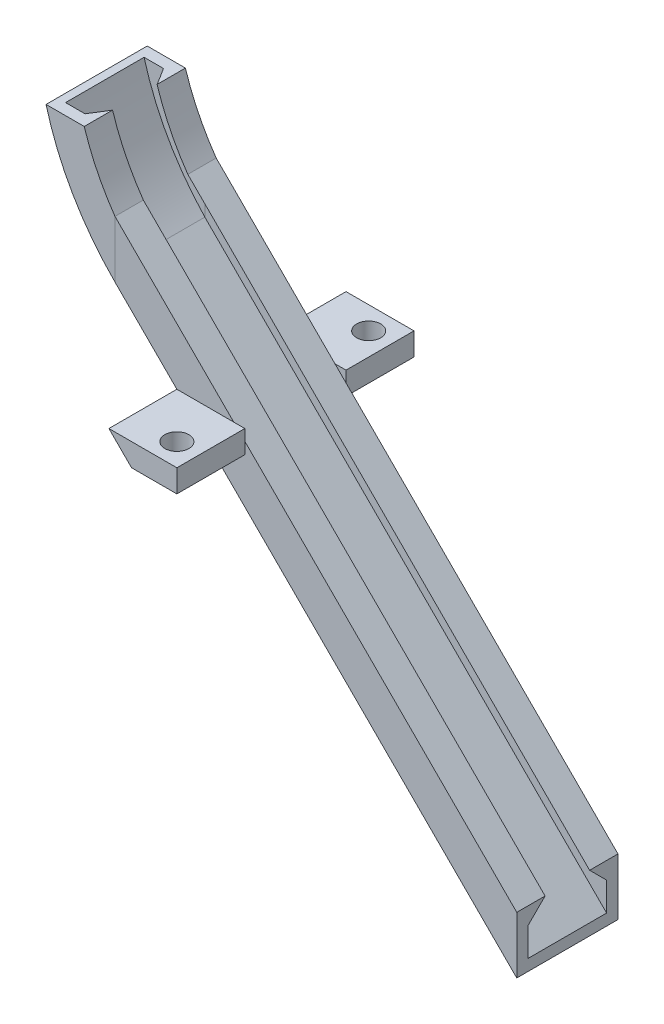
ISO-10303-21;
HEADER;
FILE_DESCRIPTION(('STEP AP214'),'2;1');
FILE_NAME('part.step','',(''),(''),'','','');
FILE_SCHEMA(('AUTOMOTIVE_DESIGN { 1 0 10303 214 1 1 1 1 }'));
ENDSEC;
DATA;
#1=APPLICATION_CONTEXT('core data for automotive mechanical design processes');
#2=APPLICATION_PROTOCOL_DEFINITION('international standard','automotive_design',2000,#1);
#3=PRODUCT_CONTEXT('',#1,'mechanical');
#4=PRODUCT('Part','Part','',(#3));
#5=PRODUCT_RELATED_PRODUCT_CATEGORY('part','',(#4));
#6=PRODUCT_DEFINITION_FORMATION('','',#4);
#7=PRODUCT_DEFINITION_CONTEXT('part definition',#1,'design');
#8=PRODUCT_DEFINITION('design','',#6,#7);
#9=PRODUCT_DEFINITION_SHAPE('','',#8);
#10=(LENGTH_UNIT() NAMED_UNIT(*) SI_UNIT(.MILLI.,.METRE.));
#11=(NAMED_UNIT(*) PLANE_ANGLE_UNIT() SI_UNIT($,.RADIAN.));
#12=(NAMED_UNIT(*) SI_UNIT($,.STERADIAN.) SOLID_ANGLE_UNIT());
#13=UNCERTAINTY_MEASURE_WITH_UNIT(LENGTH_MEASURE(1.E-05),#10,'distance_accuracy_value','');
#14=(GEOMETRIC_REPRESENTATION_CONTEXT(3) GLOBAL_UNCERTAINTY_ASSIGNED_CONTEXT((#13)) GLOBAL_UNIT_ASSIGNED_CONTEXT((#10,
#11,#12)) REPRESENTATION_CONTEXT('',''));
#15=CARTESIAN_POINT('',(0.,0.,0.));
#16=DIRECTION('',(0.,0.,1.));
#17=DIRECTION('',(1.,0.,0.));
#18=AXIS2_PLACEMENT_3D('',#15,#16,#17);
#19=CARTESIAN_POINT('',(-112.589347850484,112.589347850487,-14.175));
#20=DIRECTION('',(0.,0.,-1.));
#21=DIRECTION('',(-1.,0.,0.));
#22=AXIS2_PLACEMENT_3D('',#19,#20,#21);
#23=PLANE('',#22);
#24=DIRECTION('',(-1.,0.,0.));
#25=VECTOR('',#24,1.);
#26=CARTESIAN_POINT('',(-95.2499999999965,95.25,-14.175));
#27=LINE('',#26,#25);
#28=CARTESIAN_POINT('',(-79.3124999999975,95.25,-14.175));
#29=VERTEX_POINT('',#28);
#30=CARTESIAN_POINT('',(-95.249999999997,95.25,-14.175));
#31=VERTEX_POINT('',#30);
#32=EDGE_CURVE('E244',#29,#31,#27,.T.);
#33=ORIENTED_EDGE('',*,*,#32,.T.);
#34=DIRECTION('',(0.707106781186536,-0.707106781186559,0.));
#35=VECTOR('',#34,1.);
#36=CARTESIAN_POINT('',(-112.589347850484,112.589347850487,-14.175));
#37=LINE('',#36,#35);
#38=CARTESIAN_POINT('',(-112.589347850484,112.589347850487,-14.175));
#39=VERTEX_POINT('',#38);
#40=EDGE_CURVE('E451',#39,#31,#37,.T.);
#41=ORIENTED_EDGE('',*,*,#40,.F.);
#42=DIRECTION('',(0.,1.,0.));
#43=VECTOR('',#42,1.);
#44=CARTESIAN_POINT('',(-112.589347850484,112.589347850487,-14.175));
#45=LINE('',#44,#43);
#46=CARTESIAN_POINT('',(-112.589347850484,128.526847850487,-14.175));
#47=VERTEX_POINT('',#46);
#48=EDGE_CURVE('E434',#39,#47,#45,.T.);
#49=ORIENTED_EDGE('',*,*,#48,.T.);
#50=DIRECTION('',(0.707106781186536,-0.707106781186559,0.));
#51=VECTOR('',#50,1.);
#52=CARTESIAN_POINT('',(-112.589347850484,128.526847850487,-14.175));
#53=LINE('',#52,#51);
#54=EDGE_CURVE('E459',#47,#29,#53,.T.);
#55=ORIENTED_EDGE('',*,*,#54,.T.);
#56=EDGE_LOOP('',(#33,#41,#49,#55));
#57=FACE_BOUND('',#56,.T.);
#58=ADVANCED_FACE('F39',(#57),#23,.T.);
#59=CARTESIAN_POINT('',(-95.2499999999965,95.25,33.225));
#60=DIRECTION('',(0.,-1.,0.));
#61=DIRECTION('',(0.,0.,-1.));
#62=AXIS2_PLACEMENT_3D('',#59,#60,#61);
#63=PLANE('',#62);
#64=DIRECTION('',(-1.,0.,0.));
#65=VECTOR('',#64,1.);
#66=CARTESIAN_POINT('',(-95.2499999999965,95.25,14.175));
#67=LINE('',#66,#65);
#68=CARTESIAN_POINT('',(-76.1999999999965,95.25,14.175));
#69=VERTEX_POINT('',#68);
#70=CARTESIAN_POINT('',(-79.3124999999975,95.25,14.175));
#71=VERTEX_POINT('',#70);
#72=EDGE_CURVE('E266',#69,#71,#67,.T.);
#73=ORIENTED_EDGE('',*,*,#72,.T.);
#74=DIRECTION('',(1.,0.,0.));
#75=VECTOR('',#74,1.);
#76=CARTESIAN_POINT('',(-112.589347850484,95.25,14.175));
#77=LINE('',#76,#75);
#78=CARTESIAN_POINT('',(-95.2499999999967,95.2499999999997,14.175));
#79=VERTEX_POINT('',#78);
#80=EDGE_CURVE('E11',#79,#71,#77,.T.);
#81=ORIENTED_EDGE('',*,*,#80,.F.);
#82=DIRECTION('',(0.,0.,-1.));
#83=VECTOR('',#82,1.);
#84=CARTESIAN_POINT('',(-95.2499999999965,95.25,33.225));
#85=LINE('',#84,#83);
#86=CARTESIAN_POINT('',(-95.2499999999965,95.25,33.225));
#87=VERTEX_POINT('',#86);
#88=EDGE_CURVE('E283',#87,#79,#85,.T.);
#89=ORIENTED_EDGE('',*,*,#88,.F.);
#90=DIRECTION('',(-1.,0.,0.));
#91=VECTOR('',#90,1.);
#92=CARTESIAN_POINT('',(-95.2499999999965,95.25,33.225));
#93=LINE('',#92,#91);
#94=CARTESIAN_POINT('',(-76.1999999999965,95.25,33.225));
#95=VERTEX_POINT('',#94);
#96=EDGE_CURVE('E268',#95,#87,#93,.T.);
#97=ORIENTED_EDGE('',*,*,#96,.F.);
#98=DIRECTION('',(0.,0.,-1.));
#99=VECTOR('',#98,1.);
#100=CARTESIAN_POINT('',(-76.1999999999965,95.25,33.225));
#101=LINE('',#100,#99);
#102=EDGE_CURVE('E286',#95,#69,#101,.T.);
#103=ORIENTED_EDGE('',*,*,#102,.T.);
#104=EDGE_LOOP('',(#73,#81,#89,#97,#103));
#105=FACE_BOUND('',#104,.T.);
#106=CARTESIAN_POINT('',(-82.5499999999965,95.25,26.875));
#107=DIRECTION('',(0.,1.,0.));
#108=DIRECTION('',(0.,0.,1.));
#109=AXIS2_PLACEMENT_3D('',#106,#107,#108);
#110=CIRCLE('',#109,3.3782);
#111=CARTESIAN_POINT('',(-82.5499999999965,95.25,30.2532));
#112=VERTEX_POINT('',#111);
#113=EDGE_CURVE('E220',#112,#112,#110,.T.);
#114=ORIENTED_EDGE('',*,*,#113,.F.);
#115=EDGE_LOOP('',(#114));
#116=FACE_BOUND('',#115,.T.);
#117=ADVANCED_FACE('F392',(#105,#116),#63,.F.);
#118=CARTESIAN_POINT('',(-112.589347850484,128.526847850487,14.175));
#119=DIRECTION('',(0.,0.,1.));
#120=DIRECTION('',(1.,0.,0.));
#121=AXIS2_PLACEMENT_3D('',#118,#119,#120);
#122=PLANE('',#121);
#123=DIRECTION('',(0.,1.,0.));
#124=VECTOR('',#123,1.);
#125=CARTESIAN_POINT('',(-76.1999999999965,95.25,14.175));
#126=LINE('',#125,#124);
#127=CARTESIAN_POINT('',(-76.1999999999965,88.9,14.175));
#128=VERTEX_POINT('',#127);
#129=CARTESIAN_POINT('',(-76.1999999999965,92.1374999999989,14.175));
#130=VERTEX_POINT('',#129);
#131=EDGE_CURVE('E276',#128,#130,#126,.T.);
#132=ORIENTED_EDGE('',*,*,#131,.F.);
#133=DIRECTION('',(1.,0.,0.));
#134=VECTOR('',#133,1.);
#135=CARTESIAN_POINT('',(-76.1999999999965,88.9,14.175));
#136=LINE('',#135,#134);
#137=CARTESIAN_POINT('',(-88.8999999999965,88.9,14.175));
#138=VERTEX_POINT('',#137);
#139=EDGE_CURVE('E261',#138,#128,#136,.T.);
#140=ORIENTED_EDGE('',*,*,#139,.F.);
#141=DIRECTION('',(0.707106781186536,-0.707106781186559,0.));
#142=VECTOR('',#141,1.);
#143=CARTESIAN_POINT('',(-112.589347850484,112.589347850487,14.175));
#144=LINE('',#143,#142);
#145=CARTESIAN_POINT('',(0.,0.,14.175));
#146=VERTEX_POINT('',#145);
#147=EDGE_CURVE('E536',#138,#146,#144,.T.);
#148=ORIENTED_EDGE('',*,*,#147,.T.);
#149=DIRECTION('',(0.,-1.,0.));
#150=VECTOR('',#149,1.);
#151=CARTESIAN_POINT('',(0.,15.9375,14.175));
#152=LINE('',#151,#150);
#153=CARTESIAN_POINT('',(0.,15.9375,14.175));
#154=VERTEX_POINT('',#153);
#155=EDGE_CURVE('E47',#154,#146,#152,.T.);
#156=ORIENTED_EDGE('',*,*,#155,.F.);
#157=DIRECTION('',(0.707106781186536,-0.707106781186559,0.));
#158=VECTOR('',#157,1.);
#159=CARTESIAN_POINT('',(-112.589347850484,128.526847850487,14.175));
#160=LINE('',#159,#158);
#161=EDGE_CURVE('E530',#130,#154,#160,.T.);
#162=ORIENTED_EDGE('',*,*,#161,.F.);
#163=EDGE_LOOP('',(#132,#140,#148,#156,#162));
#164=FACE_BOUND('',#163,.T.);
#165=ADVANCED_FACE('F399',(#164),#122,.T.);
#166=CARTESIAN_POINT('',(-112.589347850484,112.589347850487,14.175));
#167=VERTEX_POINT('',#166);
#168=EDGE_CURVE('E549',#167,#79,#144,.T.);
#169=ORIENTED_EDGE('',*,*,#168,.T.);
#170=ORIENTED_EDGE('',*,*,#80,.T.);
#171=CARTESIAN_POINT('',(-112.589347850484,128.526847850487,14.175));
#172=VERTEX_POINT('',#171);
#173=EDGE_CURVE('E531',#172,#71,#160,.T.);
#174=ORIENTED_EDGE('',*,*,#173,.F.);
#175=DIRECTION('',(0.,-1.,0.));
#176=VECTOR('',#175,1.);
#177=CARTESIAN_POINT('',(-112.589347850484,128.526847850487,14.175));
#178=LINE('',#177,#176);
#179=EDGE_CURVE('E527',#172,#167,#178,.T.);
#180=ORIENTED_EDGE('',*,*,#179,.T.);
#181=EDGE_LOOP('',(#169,#170,#174,#180));
#182=FACE_BOUND('',#181,.T.);
#183=ADVANCED_FACE('F419',(#182),#122,.T.);
#184=CARTESIAN_POINT('',(-131.907864376265,146.05,-14.175));
#185=DIRECTION('',(0.,0.,-1.));
#186=DIRECTION('',(-1.,0.,0.));
#187=AXIS2_PLACEMENT_3D('',#184,#185,#186);
#188=PLANE('',#187);
#189=CARTESIAN_POINT('',(-59.810179175188,165.368516525782,-14.175));
#190=DIRECTION('',(0.,0.,1.));
#191=DIRECTION('',(-0.965925826289069,-0.258819045102518,0.));
#192=AXIS2_PLACEMENT_3D('',#189,#190,#191);
#193=CIRCLE('',#192,74.6410161513795);
#194=CARTESIAN_POINT('',(-131.907864376265,146.05,-14.175));
#195=VERTEX_POINT('',#194);
#196=EDGE_CURVE('E431',#195,#39,#193,.T.);
#197=ORIENTED_EDGE('',*,*,#196,.F.);
#198=DIRECTION('',(-1.,0.,0.));
#199=VECTOR('',#198,1.);
#200=CARTESIAN_POINT('',(-131.907864376265,146.05,-14.175));
#201=LINE('',#200,#199);
#202=CARTESIAN_POINT('',(-121.20842113763,146.05,-14.175));
#203=VERTEX_POINT('',#202);
#204=EDGE_CURVE('E293',#203,#195,#201,.T.);
#205=ORIENTED_EDGE('',*,*,#204,.F.);
#206=CARTESIAN_POINT('',(-59.810179175188,165.368516525782,-14.175));
#207=DIRECTION('',(0.,0.,1.));
#208=DIRECTION('',(-0.996320864136619,-0.085701433395606,0.));
#209=AXIS2_PLACEMENT_3D('',#206,#207,#208);
#210=CIRCLE('',#209,64.3657455238071);
#211=EDGE_CURVE('E441',#203,#47,#210,.T.);
#212=ORIENTED_EDGE('',*,*,#211,.T.);
#213=ORIENTED_EDGE('',*,*,#48,.F.);
#214=EDGE_LOOP('',(#197,#205,#212,#213));
#215=FACE_BOUND('',#214,.T.);
#216=ADVANCED_FACE('F417',(#215),#188,.T.);
#217=CARTESIAN_POINT('',(-59.810179175188,165.368516525782,0.));
#218=DIRECTION('',(0.,0.,1.));
#219=DIRECTION('',(1.,0.,0.));
#220=AXIS2_PLACEMENT_3D('',#217,#218,#219);
#221=CYLINDRICAL_SURFACE('',#220,64.3657455238071);
#222=ORIENTED_EDGE('',*,*,#211,.F.);
#223=DIRECTION('',(0.,0.,1.));
#224=VECTOR('',#223,1.);
#225=CARTESIAN_POINT('',(-121.20842113763,146.05,-14.175));
#226=LINE('',#225,#224);
#227=CARTESIAN_POINT('',(-121.20842113763,146.05,-6.23750000000006));
#228=VERTEX_POINT('',#227);
#229=EDGE_CURVE('E298',#203,#228,#226,.T.);
#230=ORIENTED_EDGE('',*,*,#229,.T.);
#231=CARTESIAN_POINT('',(-59.810179175188,165.368516525782,-6.23750000000005));
#232=DIRECTION('',(0.,0.,1.));
#233=DIRECTION('',(-0.996320864136619,-0.085701433395606,0.));
#234=AXIS2_PLACEMENT_3D('',#231,#232,#233);
#235=CIRCLE('',#234,64.3657455238071);
#236=CARTESIAN_POINT('',(-112.589347850484,128.526847850487,-6.23750000000005));
#237=VERTEX_POINT('',#236);
#238=EDGE_CURVE('E466',#228,#237,#235,.T.);
#239=ORIENTED_EDGE('',*,*,#238,.T.);
#240=DIRECTION('',(0.,0.,1.));
#241=VECTOR('',#240,1.);
#242=CARTESIAN_POINT('',(-112.589347850484,128.526847850487,-14.175));
#243=LINE('',#242,#241);
#244=EDGE_CURVE('E455',#47,#237,#243,.T.);
#245=ORIENTED_EDGE('',*,*,#244,.F.);
#246=EDGE_LOOP('',(#222,#230,#239,#245));
#247=FACE_BOUND('',#246,.T.);
#248=ADVANCED_FACE('F351',(#247),#221,.F.);
#249=CARTESIAN_POINT('',(-123.939114376265,159.852279872815,-6.23750000000005));
#250=CARTESIAN_POINT('',(-122.965185765774,148.52988587816,-6.23750000000005));
#251=CARTESIAN_POINT('',(-119.093991765968,137.845364376269,-6.23750000000005));
#252=CARTESIAN_POINT('',(-112.589347850484,128.526847850487,-6.23750000000005));
#253=CARTESIAN_POINT('',(-126.320364376265,155.727833887291,-11.));
#254=CARTESIAN_POINT('',(-124.618237140437,143.985014220275,-11.));
#255=CARTESIAN_POINT('',(-119.934843110692,133.082864376269,-11.));
#256=CARTESIAN_POINT('',(-112.589347850484,123.764347850487,-11.));
#257=(BOUNDED_SURFACE() B_SPLINE_SURFACE(1,3,((#249,#250,#251,#252),(#253,#254,#255,#256)),
.UNSPECIFIED.,.F.,.F.,.F.) B_SPLINE_SURFACE_WITH_KNOTS((2,2),(4,4),(0.,1.),(0.,1.),
.UNSPECIFIED.) GEOMETRIC_REPRESENTATION_ITEM() RATIONAL_B_SPLINE_SURFACE(((1.,0.977283884192713,
0.977283884192713,1.),(1.,0.977283884192713,0.977283884192713,1.))) REPRESENTATION_ITEM('') SURFACE());
#258=CARTESIAN_POINT('',(-121.20842113763,146.05,-6.23750000000005));
#259=CARTESIAN_POINT('',(-121.499461296084,146.05,-6.7225172972682));
#260=CARTESIAN_POINT('',(-121.793191409082,146.05,-7.20591319698354));
#261=CARTESIAN_POINT('',(-122.385701068709,146.05,-8.16959998748103));
#262=CARTESIAN_POINT('',(-122.684480606524,146.05,-8.64989088368072));
#263=CARTESIAN_POINT('',(-123.379492291307,146.05,-9.75495088731039));
#264=CARTESIAN_POINT('',(-123.777401692901,146.05,-10.3786661864485));
#265=CARTESIAN_POINT('',(-124.178979198653,146.05,-11.));
#266=B_SPLINE_CURVE_WITH_KNOTS('',3,(#258,#259,#260,#261,#262,#263,#264,#265),.UNSPECIFIED.,.F.,
.F.,(4,2,2,4),(0.,1.69689454223602,3.39378612297121,5.6132169597182),.UNSPECIFIED.);
#267=CARTESIAN_POINT('',(-124.178979198653,146.05,-11.));
#268=VERTEX_POINT('',#267);
#269=EDGE_CURVE('E331',#228,#268,#266,.T.);
#270=CARTESIAN_POINT('',(-59.810179175188,165.368516525782,-11.));
#271=DIRECTION('',(0.,0.,1.));
#272=DIRECTION('',(-0.98965737698925,-0.143451302436605,0.));
#273=AXIS2_PLACEMENT_3D('',#270,#271,#272);
#274=CIRCLE('',#273,67.2052639100366);
#275=CARTESIAN_POINT('',(-112.589347850484,123.764347850487,-11.));
#276=VERTEX_POINT('',#275);
#277=EDGE_CURVE('E476',#268,#276,#274,.T.);
#278=DIRECTION('',(0.,-0.707106781186551,-0.707106781186544));
#279=VECTOR('',#278,1.);
#280=CARTESIAN_POINT('',(-112.589347850484,128.526847850487,-6.23750000000005));
#281=LINE('',#280,#279);
#282=EDGE_CURVE('E468',#237,#276,#281,.T.);
#283=ORIENTED_EDGE('',*,*,#238,.F.);
#284=ORIENTED_EDGE('',*,*,#269,.T.);
#285=ORIENTED_EDGE('',*,*,#277,.T.);
#286=ORIENTED_EDGE('',*,*,#282,.F.);
#287=EDGE_LOOP('',(#283,#284,#285,#286));
#288=FACE_BOUND('',#287,.T.);
#289=ADVANCED_FACE('F343',(#288),#257,.T.);
#290=CARTESIAN_POINT('',(-126.320364376265,155.727833887291,-11.));
#291=DIRECTION('',(0.,0.,1.));
#292=DIRECTION('',(1.,0.,0.));
#293=AXIS2_PLACEMENT_3D('',#290,#291,#292);
#294=PLANE('',#293);
#295=ORIENTED_EDGE('',*,*,#277,.F.);
#296=DIRECTION('',(-1.,0.,0.));
#297=VECTOR('',#296,1.);
#298=CARTESIAN_POINT('',(-126.320364376265,146.05,-11.));
#299=LINE('',#298,#297);
#300=CARTESIAN_POINT('',(-129.617120916432,146.05,-11.));
#301=VERTEX_POINT('',#300);
#302=EDGE_CURVE('E341',#268,#301,#299,.T.);
#303=ORIENTED_EDGE('',*,*,#302,.T.);
#304=CARTESIAN_POINT('',(-59.810179175188,165.368516525782,-11.));
#305=DIRECTION('',(0.,0.,1.));
#306=DIRECTION('',(-0.97348406346642,-0.228754842958367,0.));
#307=AXIS2_PLACEMENT_3D('',#304,#305,#306);
#308=CIRCLE('',#307,72.430754490219);
#309=CARTESIAN_POINT('',(-112.589347850484,115.764347850487,-11.));
#310=VERTEX_POINT('',#309);
#311=EDGE_CURVE('E486',#301,#310,#308,.T.);
#312=ORIENTED_EDGE('',*,*,#311,.T.);
#313=DIRECTION('',(0.,-1.,0.));
#314=VECTOR('',#313,1.);
#315=CARTESIAN_POINT('',(-112.589347850484,123.764347850487,-11.));
#316=LINE('',#315,#314);
#317=EDGE_CURVE('E478',#276,#310,#316,.T.);
#318=ORIENTED_EDGE('',*,*,#317,.F.);
#319=EDGE_LOOP('',(#295,#303,#312,#318));
#320=FACE_BOUND('',#319,.T.);
#321=ADVANCED_FACE('F350',(#320),#294,.T.);
#322=CARTESIAN_POINT('',(-59.810179175188,165.368516525782,0.));
#323=DIRECTION('',(0.,0.,1.));
#324=DIRECTION('',(1.,0.,0.));
#325=AXIS2_PLACEMENT_3D('',#322,#323,#324);
#326=CYLINDRICAL_SURFACE('',#325,72.430754490219);
#327=ORIENTED_EDGE('',*,*,#311,.F.);
#328=DIRECTION('',(0.,0.,1.));
#329=VECTOR('',#328,1.);
#330=CARTESIAN_POINT('',(-129.617120916432,146.05,0.));
#331=LINE('',#330,#329);
#332=CARTESIAN_POINT('',(-129.617120916432,146.05,11.));
#333=VERTEX_POINT('',#332);
#334=EDGE_CURVE('E982',#301,#333,#331,.T.);
#335=ORIENTED_EDGE('',*,*,#334,.T.);
#336=CARTESIAN_POINT('',(-59.810179175188,165.368516525782,11.));
#337=DIRECTION('',(0.,0.,1.));
#338=DIRECTION('',(-0.97348406346642,-0.228754842958367,0.));
#339=AXIS2_PLACEMENT_3D('',#336,#337,#338);
#340=CIRCLE('',#339,72.430754490219);
#341=CARTESIAN_POINT('',(-112.589347850484,115.764347850487,11.));
#342=VERTEX_POINT('',#341);
#343=EDGE_CURVE('E496',#333,#342,#340,.T.);
#344=ORIENTED_EDGE('',*,*,#343,.T.);
#345=DIRECTION('',(0.,0.,1.));
#346=VECTOR('',#345,1.);
#347=CARTESIAN_POINT('',(-112.589347850484,115.764347850487,-11.));
#348=LINE('',#347,#346);
#349=EDGE_CURVE('E488',#310,#342,#348,.T.);
#350=ORIENTED_EDGE('',*,*,#349,.F.);
#351=EDGE_LOOP('',(#327,#335,#344,#350));
#352=FACE_BOUND('',#351,.T.);
#353=ADVANCED_FACE('F367',(#352),#326,.F.);
#354=CARTESIAN_POINT('',(-130.320364376265,148.799630657016,11.));
#355=DIRECTION('',(0.,0.,-1.));
#356=DIRECTION('',(-1.,0.,0.));
#357=AXIS2_PLACEMENT_3D('',#354,#355,#356);
#358=PLANE('',#357);
#359=ORIENTED_EDGE('',*,*,#343,.F.);
#360=DIRECTION('',(1.,0.,0.));
#361=VECTOR('',#360,1.);
#362=CARTESIAN_POINT('',(-130.320364376265,146.05,11.));
#363=LINE('',#362,#361);
#364=CARTESIAN_POINT('',(-124.178979198653,146.05,11.));
#365=VERTEX_POINT('',#364);
#366=EDGE_CURVE('E310',#333,#365,#363,.T.);
#367=ORIENTED_EDGE('',*,*,#366,.T.);
#368=CARTESIAN_POINT('',(-59.810179175188,165.368516525782,11.));
#369=DIRECTION('',(0.,0.,1.));
#370=DIRECTION('',(-0.98965737698925,-0.143451302436605,0.));
#371=AXIS2_PLACEMENT_3D('',#368,#369,#370);
#372=CIRCLE('',#371,67.2052639100366);
#373=CARTESIAN_POINT('',(-112.589347850484,123.764347850487,11.));
#374=VERTEX_POINT('',#373);
#375=EDGE_CURVE('E506',#365,#374,#372,.T.);
#376=ORIENTED_EDGE('',*,*,#375,.T.);
#377=DIRECTION('',(0.,1.,0.));
#378=VECTOR('',#377,1.);
#379=CARTESIAN_POINT('',(-112.589347850484,115.764347850487,11.));
#380=LINE('',#379,#378);
#381=EDGE_CURVE('E498',#342,#374,#380,.T.);
#382=ORIENTED_EDGE('',*,*,#381,.F.);
#383=EDGE_LOOP('',(#359,#367,#376,#382));
#384=FACE_BOUND('',#383,.T.);
#385=ADVANCED_FACE('F375',(#384),#358,.T.);
#386=CARTESIAN_POINT('',(-126.320364376265,155.727833887291,11.));
#387=CARTESIAN_POINT('',(-124.618237140437,143.985014220275,11.));
#388=CARTESIAN_POINT('',(-119.934843110692,133.082864376269,11.));
#389=CARTESIAN_POINT('',(-112.589347850484,123.764347850487,11.));
#390=CARTESIAN_POINT('',(-123.939114376265,159.852279872815,6.23750000000005));
#391=CARTESIAN_POINT('',(-122.965185765774,148.52988587816,6.23750000000005));
#392=CARTESIAN_POINT('',(-119.093991765968,137.845364376269,6.23750000000005));
#393=CARTESIAN_POINT('',(-112.589347850484,128.526847850487,6.23750000000005));
#394=(BOUNDED_SURFACE() B_SPLINE_SURFACE(1,3,((#386,#387,#388,#389),(#390,#391,#392,#393)),
.UNSPECIFIED.,.F.,.F.,.F.) B_SPLINE_SURFACE_WITH_KNOTS((2,2),(4,4),(0.,1.),(0.,1.),
.UNSPECIFIED.) GEOMETRIC_REPRESENTATION_ITEM() RATIONAL_B_SPLINE_SURFACE(((1.,0.977283884192713,
0.977283884192713,1.),(1.,0.977283884192713,0.977283884192713,1.))) REPRESENTATION_ITEM('') SURFACE());
#395=CARTESIAN_POINT('',(-124.178979198653,146.05,11.));
#396=CARTESIAN_POINT('',(-123.871946778726,146.05,10.5249558050745));
#397=CARTESIAN_POINT('',(-123.56706160371,146.05,10.0485184837652));
#398=CARTESIAN_POINT('',(-122.961911024015,146.05,9.09271863000911));
#399=CARTESIAN_POINT('',(-122.661645625807,146.05,8.6133560934668));
#400=CARTESIAN_POINT('',(-121.974357172612,146.05,7.50347949163457));
#401=CARTESIAN_POINT('',(-121.58909169474,146.05,6.87187701708238));
#402=CARTESIAN_POINT('',(-121.20842113763,146.05,6.23750000000005));
#403=B_SPLINE_CURVE_WITH_KNOTS('',3,(#395,#396,#397,#398,#399,#400,#401,#402),.UNSPECIFIED.,.F.,
.F.,(4,2,2,4),(0.,1.69688750426727,3.39377738485536,5.61321531243118),.UNSPECIFIED.);
#404=CARTESIAN_POINT('',(-121.20842113763,146.05,6.23750000000004));
#405=VERTEX_POINT('',#404);
#406=EDGE_CURVE('E301',#365,#405,#403,.T.);
#407=CARTESIAN_POINT('',(-59.810179175188,165.368516525782,6.23750000000005));
#408=DIRECTION('',(0.,0.,1.));
#409=DIRECTION('',(-0.996320864136619,-0.085701433395606,0.));
#410=AXIS2_PLACEMENT_3D('',#407,#408,#409);
#411=CIRCLE('',#410,64.3657455238071);
#412=CARTESIAN_POINT('',(-112.589347850484,128.526847850487,6.23750000000005));
#413=VERTEX_POINT('',#412);
#414=EDGE_CURVE('E515',#405,#413,#411,.T.);
#415=DIRECTION('',(0.,0.707106781186551,-0.707106781186544));
#416=VECTOR('',#415,1.);
#417=CARTESIAN_POINT('',(-112.589347850484,128.526847850487,6.23750000000005));
#418=LINE('',#417,#416);
#419=EDGE_CURVE('E508',#374,#413,#418,.T.);
#420=ORIENTED_EDGE('',*,*,#375,.F.);
#421=ORIENTED_EDGE('',*,*,#406,.T.);
#422=ORIENTED_EDGE('',*,*,#414,.T.);
#423=ORIENTED_EDGE('',*,*,#419,.F.);
#424=EDGE_LOOP('',(#420,#421,#422,#423));
#425=FACE_BOUND('',#424,.T.);
#426=ADVANCED_FACE('F312',(#425),#394,.T.);
#427=CARTESIAN_POINT('',(-59.810179175188,165.368516525782,0.));
#428=DIRECTION('',(0.,0.,1.));
#429=DIRECTION('',(1.,0.,0.));
#430=AXIS2_PLACEMENT_3D('',#427,#428,#429);
#431=CYLINDRICAL_SURFACE('',#430,64.3657455238071);
#432=ORIENTED_EDGE('',*,*,#414,.F.);
#433=CARTESIAN_POINT('',(-121.20842113763,146.05,14.175));
#434=VERTEX_POINT('',#433);
#435=EDGE_CURVE('E295',#405,#434,#226,.T.);
#436=ORIENTED_EDGE('',*,*,#435,.T.);
#437=CARTESIAN_POINT('',(-59.810179175188,165.368516525782,14.175));
#438=DIRECTION('',(0.,0.,1.));
#439=DIRECTION('',(-0.996320864136619,-0.085701433395606,0.));
#440=AXIS2_PLACEMENT_3D('',#437,#438,#439);
#441=CIRCLE('',#440,64.3657455238071);
#442=EDGE_CURVE('E525',#434,#172,#441,.T.);
#443=ORIENTED_EDGE('',*,*,#442,.T.);
#444=DIRECTION('',(0.,0.,1.));
#445=VECTOR('',#444,1.);
#446=CARTESIAN_POINT('',(-112.589347850484,128.526847850487,14.175));
#447=LINE('',#446,#445);
#448=EDGE_CURVE('E517',#413,#172,#447,.T.);
#449=ORIENTED_EDGE('',*,*,#448,.F.);
#450=EDGE_LOOP('',(#432,#436,#443,#449));
#451=FACE_BOUND('',#450,.T.);
#452=ADVANCED_FACE('F572',(#451),#431,.F.);
#453=CARTESIAN_POINT('',(-123.939114376265,159.852279872815,14.175));
#454=DIRECTION('',(0.,0.,1.));
#455=DIRECTION('',(1.,0.,0.));
#456=AXIS2_PLACEMENT_3D('',#453,#454,#455);
#457=PLANE('',#456);
#458=ORIENTED_EDGE('',*,*,#442,.F.);
#459=DIRECTION('',(-1.,0.,0.));
#460=VECTOR('',#459,1.);
#461=CARTESIAN_POINT('',(-131.907864376265,146.05,14.175));
#462=LINE('',#461,#460);
#463=CARTESIAN_POINT('',(-131.907864376265,146.05,14.175));
#464=VERTEX_POINT('',#463);
#465=EDGE_CURVE('E292',#434,#464,#462,.T.);
#466=ORIENTED_EDGE('',*,*,#465,.T.);
#467=CARTESIAN_POINT('',(-59.810179175188,165.368516525782,14.175));
#468=DIRECTION('',(0.,0.,1.));
#469=DIRECTION('',(-0.965925826289069,-0.258819045102518,0.));
#470=AXIS2_PLACEMENT_3D('',#467,#468,#469);
#471=CIRCLE('',#470,74.6410161513795);
#472=EDGE_CURVE('E554',#464,#167,#471,.T.);
#473=ORIENTED_EDGE('',*,*,#472,.T.);
#474=ORIENTED_EDGE('',*,*,#179,.F.);
#475=EDGE_LOOP('',(#458,#466,#473,#474));
#476=FACE_BOUND('',#475,.T.);
#477=ADVANCED_FACE('F568',(#476),#457,.T.);
#478=CARTESIAN_POINT('',(0.,0.,0.));
#479=DIRECTION('',(1.,0.,0.));
#480=DIRECTION('',(0.,0.,-1.));
#481=AXIS2_PLACEMENT_3D('',#478,#479,#480);
#482=PLANE('',#481);
#483=DIRECTION('',(0.,0.,-1.));
#484=VECTOR('',#483,1.);
#485=CARTESIAN_POINT('',(0.,0.,14.175));
#486=LINE('',#485,#484);
#487=CARTESIAN_POINT('',(0.,0.,0.));
#488=VERTEX_POINT('',#487);
#489=EDGE_CURVE('E541',#146,#488,#486,.T.);
#490=ORIENTED_EDGE('',*,*,#489,.T.);
#491=DIRECTION('',(0.,0.,-1.));
#492=VECTOR('',#491,1.);
#493=CARTESIAN_POINT('',(0.,0.,0.));
#494=LINE('',#493,#492);
#495=CARTESIAN_POINT('',(0.,0.,-14.175));
#496=VERTEX_POINT('',#495);
#497=EDGE_CURVE('E447',#488,#496,#494,.T.);
#498=ORIENTED_EDGE('',*,*,#497,.T.);
#499=DIRECTION('',(0.,1.,0.));
#500=VECTOR('',#499,1.);
#501=CARTESIAN_POINT('',(0.,0.,-14.175));
#502=LINE('',#501,#500);
#503=CARTESIAN_POINT('',(0.,15.9375,-14.175));
#504=VERTEX_POINT('',#503);
#505=EDGE_CURVE('E452',#496,#504,#502,.T.);
#506=ORIENTED_EDGE('',*,*,#505,.T.);
#507=DIRECTION('',(0.,0.,1.));
#508=VECTOR('',#507,1.);
#509=CARTESIAN_POINT('',(0.,15.9375,-14.175));
#510=LINE('',#509,#508);
#511=CARTESIAN_POINT('',(0.,15.9375,-6.23750000000005));
#512=VERTEX_POINT('',#511);
#513=EDGE_CURVE('E462',#504,#512,#510,.T.);
#514=ORIENTED_EDGE('',*,*,#513,.T.);
#515=DIRECTION('',(0.,-0.707106781186551,-0.707106781186544));
#516=VECTOR('',#515,1.);
#517=CARTESIAN_POINT('',(0.,15.9375,-6.23750000000005));
#518=LINE('',#517,#516);
#519=CARTESIAN_POINT('',(0.,11.175,-11.));
#520=VERTEX_POINT('',#519);
#521=EDGE_CURVE('E473',#512,#520,#518,.T.);
#522=ORIENTED_EDGE('',*,*,#521,.T.);
#523=DIRECTION('',(0.,-1.,0.));
#524=VECTOR('',#523,1.);
#525=CARTESIAN_POINT('',(0.,11.175,-11.));
#526=LINE('',#525,#524);
#527=CARTESIAN_POINT('',(0.,3.17500000000001,-11.));
#528=VERTEX_POINT('',#527);
#529=EDGE_CURVE('E483',#520,#528,#526,.T.);
#530=ORIENTED_EDGE('',*,*,#529,.T.);
#531=DIRECTION('',(0.,0.,1.));
#532=VECTOR('',#531,1.);
#533=CARTESIAN_POINT('',(0.,3.17500000000001,-11.));
#534=LINE('',#533,#532);
#535=CARTESIAN_POINT('',(0.,3.17500000000001,11.));
#536=VERTEX_POINT('',#535);
#537=EDGE_CURVE('E493',#528,#536,#534,.T.);
#538=ORIENTED_EDGE('',*,*,#537,.T.);
#539=DIRECTION('',(0.,1.,0.));
#540=VECTOR('',#539,1.);
#541=CARTESIAN_POINT('',(0.,3.175,11.));
#542=LINE('',#541,#540);
#543=CARTESIAN_POINT('',(0.,11.175,11.));
#544=VERTEX_POINT('',#543);
#545=EDGE_CURVE('E503',#536,#544,#542,.T.);
#546=ORIENTED_EDGE('',*,*,#545,.T.);
#547=DIRECTION('',(0.,0.707106781186551,-0.707106781186544));
#548=VECTOR('',#547,1.);
#549=CARTESIAN_POINT('',(0.,15.9375,6.23750000000005));
#550=LINE('',#549,#548);
#551=CARTESIAN_POINT('',(0.,15.9375,6.23750000000005));
#552=VERTEX_POINT('',#551);
#553=EDGE_CURVE('E512',#544,#552,#550,.T.);
#554=ORIENTED_EDGE('',*,*,#553,.T.);
#555=DIRECTION('',(0.,0.,1.));
#556=VECTOR('',#555,1.);
#557=CARTESIAN_POINT('',(0.,15.9375,14.175));
#558=LINE('',#557,#556);
#559=EDGE_CURVE('E522',#552,#154,#558,.T.);
#560=ORIENTED_EDGE('',*,*,#559,.T.);
#561=ORIENTED_EDGE('',*,*,#155,.T.);
#562=EDGE_LOOP('',(#490,#498,#506,#514,#522,#530,#538,#546,#554,#560,#561));
#563=FACE_BOUND('',#562,.T.);
#564=ADVANCED_FACE('F41',(#563),#482,.T.);
#565=CARTESIAN_POINT('',(-59.810179175188,165.368516525782,0.));
#566=DIRECTION('',(0.,0.,1.));
#567=DIRECTION('',(1.,0.,0.));
#568=AXIS2_PLACEMENT_3D('',#565,#566,#567);
#569=CYLINDRICAL_SURFACE('',#568,74.6410161513795);
#570=CARTESIAN_POINT('',(-59.810179175188,165.368516525782,0.));
#571=DIRECTION('',(0.,0.,1.));
#572=DIRECTION('',(-0.965925826289069,-0.258819045102518,0.));
#573=AXIS2_PLACEMENT_3D('',#570,#571,#572);
#574=CIRCLE('',#573,74.6410161513795);
#575=CARTESIAN_POINT('',(-131.907864376265,146.05,0.));
#576=VERTEX_POINT('',#575);
#577=CARTESIAN_POINT('',(-112.589347850484,112.589347850487,0.));
#578=VERTEX_POINT('',#577);
#579=EDGE_CURVE('E443',#576,#578,#574,.T.);
#580=ORIENTED_EDGE('',*,*,#579,.T.);
#581=DIRECTION('',(0.,0.,-1.));
#582=VECTOR('',#581,1.);
#583=CARTESIAN_POINT('',(-112.589347850484,112.589347850487,14.175));
#584=LINE('',#583,#582);
#585=EDGE_CURVE('E559',#167,#578,#584,.T.);
#586=ORIENTED_EDGE('',*,*,#585,.F.);
#587=ORIENTED_EDGE('',*,*,#472,.F.);
#588=DIRECTION('',(0.,0.,-1.));
#589=VECTOR('',#588,1.);
#590=CARTESIAN_POINT('',(-131.907864376265,146.05,14.175));
#591=LINE('',#590,#589);
#592=EDGE_CURVE('E340',#464,#576,#591,.T.);
#593=ORIENTED_EDGE('',*,*,#592,.T.);
#594=EDGE_LOOP('',(#580,#586,#587,#593));
#595=FACE_BOUND('',#594,.T.);
#596=ADVANCED_FACE('F327',(#595),#569,.T.);
#597=CARTESIAN_POINT('',(-59.810179175188,165.368516525782,0.));
#598=DIRECTION('',(0.,0.,1.));
#599=DIRECTION('',(1.,0.,0.));
#600=AXIS2_PLACEMENT_3D('',#597,#598,#599);
#601=CYLINDRICAL_SURFACE('',#600,74.6410161513795);
#602=ORIENTED_EDGE('',*,*,#196,.T.);
#603=DIRECTION('',(0.,0.,-1.));
#604=VECTOR('',#603,1.);
#605=CARTESIAN_POINT('',(-112.589347850484,112.589347850487,0.));
#606=LINE('',#605,#604);
#607=EDGE_CURVE('E439',#578,#39,#606,.T.);
#608=ORIENTED_EDGE('',*,*,#607,.F.);
#609=ORIENTED_EDGE('',*,*,#579,.F.);
#610=DIRECTION('',(0.,0.,-1.));
#611=VECTOR('',#610,1.);
#612=CARTESIAN_POINT('',(-131.907864376265,146.05,0.));
#613=LINE('',#612,#611);
#614=EDGE_CURVE('E556',#576,#195,#613,.T.);
#615=ORIENTED_EDGE('',*,*,#614,.T.);
#616=EDGE_LOOP('',(#602,#608,#609,#615));
#617=FACE_BOUND('',#616,.T.);
#618=ADVANCED_FACE('F414',(#617),#601,.T.);
#619=CARTESIAN_POINT('',(-112.589347850484,112.589347850487,14.175));
#620=DIRECTION('',(-0.707106781186559,-0.707106781186536,0.));
#621=DIRECTION('',(0.707106781186536,-0.707106781186559,0.));
#622=AXIS2_PLACEMENT_3D('',#619,#620,#621);
#623=PLANE('',#622);
#624=DIRECTION('',(0.707106781186536,-0.707106781186559,0.));
#625=VECTOR('',#624,1.);
#626=CARTESIAN_POINT('',(-112.589347850484,112.589347850487,0.));
#627=LINE('',#626,#625);
#628=EDGE_CURVE('E450',#578,#488,#627,.T.);
#629=ORIENTED_EDGE('',*,*,#628,.T.);
#630=ORIENTED_EDGE('',*,*,#489,.F.);
#631=ORIENTED_EDGE('',*,*,#147,.F.);
#632=DIRECTION('',(0.,0.,-1.));
#633=VECTOR('',#632,1.);
#634=CARTESIAN_POINT('',(-88.8999999999965,88.9,33.225));
#635=LINE('',#634,#633);
#636=CARTESIAN_POINT('',(-88.8999999999965,88.9,33.225));
#637=VERTEX_POINT('',#636);
#638=EDGE_CURVE('E272',#637,#138,#635,.T.);
#639=ORIENTED_EDGE('',*,*,#638,.F.);
#640=DIRECTION('',(0.707106781186547,-0.707106781186547,0.));
#641=VECTOR('',#640,1.);
#642=CARTESIAN_POINT('',(-88.8999999999965,88.9,33.225));
#643=LINE('',#642,#641);
#644=EDGE_CURVE('E270',#87,#637,#643,.T.);
#645=ORIENTED_EDGE('',*,*,#644,.F.);
#646=ORIENTED_EDGE('',*,*,#88,.T.);
#647=ORIENTED_EDGE('',*,*,#168,.F.);
#648=ORIENTED_EDGE('',*,*,#585,.T.);
#649=EDGE_LOOP('',(#629,#630,#631,#639,#645,#646,#647,#648));
#650=FACE_BOUND('',#649,.T.);
#651=ADVANCED_FACE('F409',(#650),#623,.T.);
#652=CARTESIAN_POINT('',(-112.589347850484,112.589347850487,0.));
#653=DIRECTION('',(-0.707106781186559,-0.707106781186536,0.));
#654=DIRECTION('',(0.707106781186536,-0.707106781186559,0.));
#655=AXIS2_PLACEMENT_3D('',#652,#653,#654);
#656=PLANE('',#655);
#657=ORIENTED_EDGE('',*,*,#40,.T.);
#658=DIRECTION('',(0.,0.,1.));
#659=VECTOR('',#658,1.);
#660=CARTESIAN_POINT('',(-95.2499999999965,95.25,-33.225));
#661=LINE('',#660,#659);
#662=CARTESIAN_POINT('',(-95.2499999999965,95.25,-33.225));
#663=VERTEX_POINT('',#662);
#664=EDGE_CURVE('E221',#663,#31,#661,.T.);
#665=ORIENTED_EDGE('',*,*,#664,.F.);
#666=DIRECTION('',(0.707106781186547,-0.707106781186547,0.));
#667=VECTOR('',#666,1.);
#668=CARTESIAN_POINT('',(-88.8999999999965,88.9,-33.225));
#669=LINE('',#668,#667);
#670=CARTESIAN_POINT('',(-88.8999999999965,88.9,-33.225));
#671=VERTEX_POINT('',#670);
#672=EDGE_CURVE('E227',#663,#671,#669,.T.);
#673=ORIENTED_EDGE('',*,*,#672,.T.);
#674=DIRECTION('',(0.,0.,1.));
#675=VECTOR('',#674,1.);
#676=CARTESIAN_POINT('',(-88.8999999999965,88.9,-33.225));
#677=LINE('',#676,#675);
#678=CARTESIAN_POINT('',(-88.8999999999969,88.8999999999996,-14.175));
#679=VERTEX_POINT('',#678);
#680=EDGE_CURVE('E213',#671,#679,#677,.T.);
#681=ORIENTED_EDGE('',*,*,#680,.T.);
#682=EDGE_CURVE('E59',#679,#496,#37,.T.);
#683=ORIENTED_EDGE('',*,*,#682,.T.);
#684=ORIENTED_EDGE('',*,*,#497,.F.);
#685=ORIENTED_EDGE('',*,*,#628,.F.);
#686=ORIENTED_EDGE('',*,*,#607,.T.);
#687=EDGE_LOOP('',(#657,#665,#673,#681,#683,#684,#685,#686));
#688=FACE_BOUND('',#687,.T.);
#689=ADVANCED_FACE('F234',(#688),#656,.T.);
#690=DIRECTION('',(1.,0.,0.));
#691=VECTOR('',#690,1.);
#692=CARTESIAN_POINT('',(-76.1999999999965,88.9,-14.175));
#693=LINE('',#692,#691);
#694=CARTESIAN_POINT('',(-76.1999999999965,88.9,-14.175));
#695=VERTEX_POINT('',#694);
#696=EDGE_CURVE('E54',#679,#695,#693,.T.);
#697=ORIENTED_EDGE('',*,*,#696,.T.);
#698=DIRECTION('',(0.,1.,0.));
#699=VECTOR('',#698,1.);
#700=CARTESIAN_POINT('',(-76.1999999999965,95.25,-14.175));
#701=LINE('',#700,#699);
#702=CARTESIAN_POINT('',(-76.1999999999965,92.1374999999989,-14.175));
#703=VERTEX_POINT('',#702);
#704=EDGE_CURVE('E231',#695,#703,#701,.T.);
#705=ORIENTED_EDGE('',*,*,#704,.T.);
#706=EDGE_CURVE('E458',#703,#504,#53,.T.);
#707=ORIENTED_EDGE('',*,*,#706,.T.);
#708=ORIENTED_EDGE('',*,*,#505,.F.);
#709=ORIENTED_EDGE('',*,*,#682,.F.);
#710=EDGE_LOOP('',(#697,#705,#707,#708,#709));
#711=FACE_BOUND('',#710,.T.);
#712=ADVANCED_FACE('F395',(#711),#23,.T.);
#713=CARTESIAN_POINT('',(-112.589347850484,128.526847850487,-14.175));
#714=DIRECTION('',(0.707106781186559,0.707106781186536,0.));
#715=DIRECTION('',(-0.707106781186536,0.707106781186559,0.));
#716=AXIS2_PLACEMENT_3D('',#713,#714,#715);
#717=PLANE('',#716);
#718=DIRECTION('',(0.707106781186536,-0.707106781186559,0.));
#719=VECTOR('',#718,1.);
#720=CARTESIAN_POINT('',(-112.589347850484,128.526847850487,-6.23750000000005));
#721=LINE('',#720,#719);
#722=EDGE_CURVE('E470',#237,#512,#721,.T.);
#723=ORIENTED_EDGE('',*,*,#722,.T.);
#724=ORIENTED_EDGE('',*,*,#513,.F.);
#725=ORIENTED_EDGE('',*,*,#706,.F.);
#726=EDGE_CURVE('E463',#29,#703,#53,.T.);
#727=ORIENTED_EDGE('',*,*,#726,.F.);
#728=ORIENTED_EDGE('',*,*,#54,.F.);
#729=ORIENTED_EDGE('',*,*,#244,.T.);
#730=EDGE_LOOP('',(#723,#724,#725,#727,#728,#729));
#731=FACE_BOUND('',#730,.T.);
#732=ADVANCED_FACE('F353',(#731),#717,.T.);
#733=CARTESIAN_POINT('',(-112.589347850484,128.526847850487,-6.23750000000005));
#734=DIRECTION('',(-0.577350269189636,-0.577350269189618,0.577350269189624));
#735=DIRECTION('',(0.70710678118654,0.,0.707106781186555));
#736=AXIS2_PLACEMENT_3D('',#733,#734,#735);
#737=PLANE('',#736);
#738=DIRECTION('',(0.707106781186536,-0.707106781186559,0.));
#739=VECTOR('',#738,1.);
#740=CARTESIAN_POINT('',(-112.589347850484,123.764347850487,-11.));
#741=LINE('',#740,#739);
#742=EDGE_CURVE('E480',#276,#520,#741,.T.);
#743=ORIENTED_EDGE('',*,*,#742,.T.);
#744=ORIENTED_EDGE('',*,*,#521,.F.);
#745=ORIENTED_EDGE('',*,*,#722,.F.);
#746=ORIENTED_EDGE('',*,*,#282,.T.);
#747=EDGE_LOOP('',(#743,#744,#745,#746));
#748=FACE_BOUND('',#747,.T.);
#749=ADVANCED_FACE('F355',(#748),#737,.T.);
#750=CARTESIAN_POINT('',(-112.589347850484,123.764347850487,-11.));
#751=DIRECTION('',(0.,0.,1.));
#752=DIRECTION('',(1.,0.,0.));
#753=AXIS2_PLACEMENT_3D('',#750,#751,#752);
#754=PLANE('',#753);
#755=DIRECTION('',(0.707106781186536,-0.707106781186559,0.));
#756=VECTOR('',#755,1.);
#757=CARTESIAN_POINT('',(-112.589347850484,115.764347850487,-11.));
#758=LINE('',#757,#756);
#759=EDGE_CURVE('E490',#310,#528,#758,.T.);
#760=ORIENTED_EDGE('',*,*,#759,.T.);
#761=ORIENTED_EDGE('',*,*,#529,.F.);
#762=ORIENTED_EDGE('',*,*,#742,.F.);
#763=ORIENTED_EDGE('',*,*,#317,.T.);
#764=EDGE_LOOP('',(#760,#761,#762,#763));
#765=FACE_BOUND('',#764,.T.);
#766=ADVANCED_FACE('F363',(#765),#754,.T.);
#767=CARTESIAN_POINT('',(-112.589347850484,115.764347850487,-11.));
#768=DIRECTION('',(0.707106781186559,0.707106781186536,0.));
#769=DIRECTION('',(-0.707106781186536,0.707106781186559,0.));
#770=AXIS2_PLACEMENT_3D('',#767,#768,#769);
#771=PLANE('',#770);
#772=DIRECTION('',(0.707106781186536,-0.707106781186559,0.));
#773=VECTOR('',#772,1.);
#774=CARTESIAN_POINT('',(-112.589347850484,115.764347850487,11.));
#775=LINE('',#774,#773);
#776=EDGE_CURVE('E500',#342,#536,#775,.T.);
#777=ORIENTED_EDGE('',*,*,#776,.T.);
#778=ORIENTED_EDGE('',*,*,#537,.F.);
#779=ORIENTED_EDGE('',*,*,#759,.F.);
#780=ORIENTED_EDGE('',*,*,#349,.T.);
#781=EDGE_LOOP('',(#777,#778,#779,#780));
#782=FACE_BOUND('',#781,.T.);
#783=ADVANCED_FACE('F371',(#782),#771,.T.);
#784=CARTESIAN_POINT('',(-112.589347850484,115.764347850487,11.));
#785=DIRECTION('',(0.,0.,-1.));
#786=DIRECTION('',(-1.,0.,0.));
#787=AXIS2_PLACEMENT_3D('',#784,#785,#786);
#788=PLANE('',#787);
#789=DIRECTION('',(0.707106781186536,-0.707106781186559,0.));
#790=VECTOR('',#789,1.);
#791=CARTESIAN_POINT('',(-112.589347850484,123.764347850487,11.));
#792=LINE('',#791,#790);
#793=EDGE_CURVE('E510',#374,#544,#792,.T.);
#794=ORIENTED_EDGE('',*,*,#793,.T.);
#795=ORIENTED_EDGE('',*,*,#545,.F.);
#796=ORIENTED_EDGE('',*,*,#776,.F.);
#797=ORIENTED_EDGE('',*,*,#381,.T.);
#798=EDGE_LOOP('',(#794,#795,#796,#797));
#799=FACE_BOUND('',#798,.T.);
#800=ADVANCED_FACE('F379',(#799),#788,.T.);
#801=CARTESIAN_POINT('',(-112.589347850484,128.526847850487,6.23750000000005));
#802=DIRECTION('',(-0.577350269189636,-0.577350269189618,-0.577350269189624));
#803=DIRECTION('',(-0.70710678118654,0.,0.707106781186555));
#804=AXIS2_PLACEMENT_3D('',#801,#802,#803);
#805=PLANE('',#804);
#806=DIRECTION('',(0.707106781186536,-0.707106781186559,0.));
#807=VECTOR('',#806,1.);
#808=CARTESIAN_POINT('',(-112.589347850484,128.526847850487,6.23750000000005));
#809=LINE('',#808,#807);
#810=EDGE_CURVE('E519',#413,#552,#809,.T.);
#811=ORIENTED_EDGE('',*,*,#810,.T.);
#812=ORIENTED_EDGE('',*,*,#553,.F.);
#813=ORIENTED_EDGE('',*,*,#793,.F.);
#814=ORIENTED_EDGE('',*,*,#419,.T.);
#815=EDGE_LOOP('',(#811,#812,#813,#814));
#816=FACE_BOUND('',#815,.T.);
#817=ADVANCED_FACE('F384',(#816),#805,.T.);
#818=CARTESIAN_POINT('',(-112.589347850484,128.526847850487,14.175));
#819=DIRECTION('',(0.707106781186559,0.707106781186536,0.));
#820=DIRECTION('',(-0.707106781186536,0.707106781186559,0.));
#821=AXIS2_PLACEMENT_3D('',#818,#819,#820);
#822=PLANE('',#821);
#823=ORIENTED_EDGE('',*,*,#173,.T.);
#824=EDGE_CURVE('E534',#71,#130,#160,.T.);
#825=ORIENTED_EDGE('',*,*,#824,.T.);
#826=ORIENTED_EDGE('',*,*,#161,.T.);
#827=ORIENTED_EDGE('',*,*,#559,.F.);
#828=ORIENTED_EDGE('',*,*,#810,.F.);
#829=ORIENTED_EDGE('',*,*,#448,.T.);
#830=EDGE_LOOP('',(#823,#825,#826,#827,#828,#829));
#831=FACE_BOUND('',#830,.T.);
#832=ADVANCED_FACE('F324',(#831),#822,.T.);
#833=CARTESIAN_POINT('',(-131.907864376265,146.05,-14.175));
#834=DIRECTION('',(0.,1.,0.));
#835=DIRECTION('',(0.,0.,1.));
#836=AXIS2_PLACEMENT_3D('',#833,#834,#835);
#837=PLANE('',#836);
#838=ORIENTED_EDGE('',*,*,#229,.F.);
#839=ORIENTED_EDGE('',*,*,#204,.T.);
#840=ORIENTED_EDGE('',*,*,#614,.F.);
#841=ORIENTED_EDGE('',*,*,#592,.F.);
#842=ORIENTED_EDGE('',*,*,#465,.F.);
#843=ORIENTED_EDGE('',*,*,#435,.F.);
#844=ORIENTED_EDGE('',*,*,#406,.F.);
#845=ORIENTED_EDGE('',*,*,#366,.F.);
#846=ORIENTED_EDGE('',*,*,#334,.F.);
#847=ORIENTED_EDGE('',*,*,#302,.F.);
#848=ORIENTED_EDGE('',*,*,#269,.F.);
#849=EDGE_LOOP('',(#838,#839,#840,#841,#842,#843,#844,#845,#846,#847,#848));
#850=FACE_BOUND('',#849,.T.);
#851=ADVANCED_FACE('F318',(#850),#837,.T.);
#852=CARTESIAN_POINT('',(-76.1999999999965,88.9,33.225));
#853=DIRECTION('',(0.,1.,0.));
#854=DIRECTION('',(0.,0.,1.));
#855=AXIS2_PLACEMENT_3D('',#852,#853,#854);
#856=PLANE('',#855);
#857=CARTESIAN_POINT('',(-82.5499999999965,88.9,26.875));
#858=DIRECTION('',(0.,1.,0.));
#859=DIRECTION('',(0.,0.,1.));
#860=AXIS2_PLACEMENT_3D('',#857,#858,#859);
#861=CIRCLE('',#860,3.3782);
#862=CARTESIAN_POINT('',(-82.5499999999965,88.9,30.2532));
#863=VERTEX_POINT('',#862);
#864=EDGE_CURVE('E258',#863,#863,#861,.T.);
#865=ORIENTED_EDGE('',*,*,#864,.T.);
#866=EDGE_LOOP('',(#865));
#867=FACE_BOUND('',#866,.T.);
#868=ORIENTED_EDGE('',*,*,#139,.T.);
#869=DIRECTION('',(0.,0.,-1.));
#870=VECTOR('',#869,1.);
#871=CARTESIAN_POINT('',(-76.1999999999965,88.9,33.225));
#872=LINE('',#871,#870);
#873=CARTESIAN_POINT('',(-76.1999999999965,88.9,33.225));
#874=VERTEX_POINT('',#873);
#875=EDGE_CURVE('E289',#874,#128,#872,.T.);
#876=ORIENTED_EDGE('',*,*,#875,.F.);
#877=DIRECTION('',(1.,0.,0.));
#878=VECTOR('',#877,1.);
#879=CARTESIAN_POINT('',(-76.1999999999965,88.9,33.225));
#880=LINE('',#879,#878);
#881=EDGE_CURVE('E262',#637,#874,#880,.T.);
#882=ORIENTED_EDGE('',*,*,#881,.F.);
#883=ORIENTED_EDGE('',*,*,#638,.T.);
#884=EDGE_LOOP('',(#868,#876,#882,#883));
#885=FACE_BOUND('',#884,.T.);
#886=ADVANCED_FACE('F323',(#867,#885),#856,.F.);
#887=CARTESIAN_POINT('',(-76.1999999999965,95.25,33.225));
#888=DIRECTION('',(-1.,0.,0.));
#889=DIRECTION('',(0.,0.,1.));
#890=AXIS2_PLACEMENT_3D('',#887,#888,#889);
#891=PLANE('',#890);
#892=ORIENTED_EDGE('',*,*,#131,.T.);
#893=EDGE_CURVE('E275',#130,#69,#126,.T.);
#894=ORIENTED_EDGE('',*,*,#893,.T.);
#895=ORIENTED_EDGE('',*,*,#102,.F.);
#896=DIRECTION('',(0.,1.,0.));
#897=VECTOR('',#896,1.);
#898=CARTESIAN_POINT('',(-76.1999999999965,95.25,33.225));
#899=LINE('',#898,#897);
#900=EDGE_CURVE('E265',#874,#95,#899,.T.);
#901=ORIENTED_EDGE('',*,*,#900,.F.);
#902=ORIENTED_EDGE('',*,*,#875,.T.);
#903=EDGE_LOOP('',(#892,#894,#895,#901,#902));
#904=FACE_BOUND('',#903,.T.);
#905=ADVANCED_FACE('F642',(#904),#891,.F.);
#906=CARTESIAN_POINT('',(0.,0.,33.225));
#907=DIRECTION('',(0.,0.,1.));
#908=DIRECTION('',(1.,0.,0.));
#909=AXIS2_PLACEMENT_3D('',#906,#907,#908);
#910=PLANE('',#909);
#911=ORIENTED_EDGE('',*,*,#881,.T.);
#912=ORIENTED_EDGE('',*,*,#900,.T.);
#913=ORIENTED_EDGE('',*,*,#96,.T.);
#914=ORIENTED_EDGE('',*,*,#644,.T.);
#915=EDGE_LOOP('',(#911,#912,#913,#914));
#916=FACE_BOUND('',#915,.T.);
#917=ADVANCED_FACE('F639',(#916),#910,.T.);
#918=CARTESIAN_POINT('',(0.,0.,14.175));
#919=DIRECTION('',(0.,0.,1.));
#920=DIRECTION('',(1.,0.,0.));
#921=AXIS2_PLACEMENT_3D('',#918,#919,#920);
#922=PLANE('',#921);
#923=ORIENTED_EDGE('',*,*,#824,.F.);
#924=ORIENTED_EDGE('',*,*,#72,.F.);
#925=ORIENTED_EDGE('',*,*,#893,.F.);
#926=EDGE_LOOP('',(#923,#924,#925));
#927=FACE_BOUND('',#926,.T.);
#928=ADVANCED_FACE('F637',(#927),#922,.F.);
#929=CARTESIAN_POINT('',(-82.5499999999965,95.25,26.875));
#930=DIRECTION('',(0.,1.,0.));
#931=DIRECTION('',(0.,0.,1.));
#932=AXIS2_PLACEMENT_3D('',#929,#930,#931);
#933=CYLINDRICAL_SURFACE('',#932,3.3782);
#934=ORIENTED_EDGE('',*,*,#864,.F.);
#935=EDGE_LOOP('',(#934));
#936=FACE_BOUND('',#935,.T.);
#937=ORIENTED_EDGE('',*,*,#113,.T.);
#938=EDGE_LOOP('',(#937));
#939=FACE_BOUND('',#938,.T.);
#940=ADVANCED_FACE('F633',(#936,#939),#933,.F.);
#941=CARTESIAN_POINT('',(-76.1999999999965,88.9,-33.225));
#942=DIRECTION('',(0.,-1.,0.));
#943=DIRECTION('',(0.,0.,-1.));
#944=AXIS2_PLACEMENT_3D('',#941,#942,#943);
#945=PLANE('',#944);
#946=CARTESIAN_POINT('',(-82.5499999999965,88.9,-26.875));
#947=DIRECTION('',(0.,-1.,0.));
#948=DIRECTION('',(0.,0.,-1.));
#949=AXIS2_PLACEMENT_3D('',#946,#947,#948);
#950=CIRCLE('',#949,3.3782);
#951=CARTESIAN_POINT('',(-82.5499999999965,88.9,-30.2532));
#952=VERTEX_POINT('',#951);
#953=EDGE_CURVE('E245',#952,#952,#950,.T.);
#954=ORIENTED_EDGE('',*,*,#953,.F.);
#955=EDGE_LOOP('',(#954));
#956=FACE_BOUND('',#955,.T.);
#957=ORIENTED_EDGE('',*,*,#696,.F.);
#958=ORIENTED_EDGE('',*,*,#680,.F.);
#959=DIRECTION('',(1.,0.,0.));
#960=VECTOR('',#959,1.);
#961=CARTESIAN_POINT('',(-76.1999999999965,88.9,-33.225));
#962=LINE('',#961,#960);
#963=CARTESIAN_POINT('',(-76.1999999999965,88.9,-33.225));
#964=VERTEX_POINT('',#963);
#965=EDGE_CURVE('E216',#671,#964,#962,.T.);
#966=ORIENTED_EDGE('',*,*,#965,.T.);
#967=DIRECTION('',(0.,0.,1.));
#968=VECTOR('',#967,1.);
#969=CARTESIAN_POINT('',(-76.1999999999965,88.9,-33.225));
#970=LINE('',#969,#968);
#971=EDGE_CURVE('E242',#964,#695,#970,.T.);
#972=ORIENTED_EDGE('',*,*,#971,.T.);
#973=EDGE_LOOP('',(#957,#958,#966,#972));
#974=FACE_BOUND('',#973,.T.);
#975=ADVANCED_FACE('F215',(#956,#974),#945,.T.);
#976=CARTESIAN_POINT('',(-95.2499999999965,95.25,-33.225));
#977=DIRECTION('',(0.,1.,0.));
#978=DIRECTION('',(0.,0.,1.));
#979=AXIS2_PLACEMENT_3D('',#976,#977,#978);
#980=PLANE('',#979);
#981=CARTESIAN_POINT('',(-82.5499999999965,95.25,-26.875));
#982=DIRECTION('',(0.,1.,0.));
#983=DIRECTION('',(0.,0.,1.));
#984=AXIS2_PLACEMENT_3D('',#981,#982,#983);
#985=CIRCLE('',#984,3.3782);
#986=CARTESIAN_POINT('',(-82.5499999999965,95.25,-23.4968));
#987=VERTEX_POINT('',#986);
#988=EDGE_CURVE('E978',#987,#987,#985,.T.);
#989=ORIENTED_EDGE('',*,*,#988,.F.);
#990=EDGE_LOOP('',(#989));
#991=FACE_BOUND('',#990,.T.);
#992=CARTESIAN_POINT('',(-76.1999999999965,95.25,-14.175));
#993=VERTEX_POINT('',#992);
#994=EDGE_CURVE('E246',#993,#29,#27,.T.);
#995=ORIENTED_EDGE('',*,*,#994,.F.);
#996=DIRECTION('',(0.,0.,1.));
#997=VECTOR('',#996,1.);
#998=CARTESIAN_POINT('',(-76.1999999999965,95.25,-33.225));
#999=LINE('',#998,#997);
#1000=CARTESIAN_POINT('',(-76.1999999999965,95.25,-33.225));
#1001=VERTEX_POINT('',#1000);
#1002=EDGE_CURVE('E252',#1001,#993,#999,.T.);
#1003=ORIENTED_EDGE('',*,*,#1002,.F.);
#1004=DIRECTION('',(-1.,0.,0.));
#1005=VECTOR('',#1004,1.);
#1006=CARTESIAN_POINT('',(-95.2499999999965,95.25,-33.225));
#1007=LINE('',#1006,#1005);
#1008=EDGE_CURVE('E236',#1001,#663,#1007,.T.);
#1009=ORIENTED_EDGE('',*,*,#1008,.T.);
#1010=ORIENTED_EDGE('',*,*,#664,.T.);
#1011=ORIENTED_EDGE('',*,*,#32,.F.);
#1012=EDGE_LOOP('',(#995,#1003,#1009,#1010,#1011));
#1013=FACE_BOUND('',#1012,.T.);
#1014=ADVANCED_FACE('F607',(#991,#1013),#980,.T.);
#1015=CARTESIAN_POINT('',(-76.1999999999965,95.25,-33.225));
#1016=DIRECTION('',(1.,0.,0.));
#1017=DIRECTION('',(0.,0.,-1.));
#1018=AXIS2_PLACEMENT_3D('',#1015,#1016,#1017);
#1019=PLANE('',#1018);
#1020=ORIENTED_EDGE('',*,*,#704,.F.);
#1021=ORIENTED_EDGE('',*,*,#971,.F.);
#1022=DIRECTION('',(0.,1.,0.));
#1023=VECTOR('',#1022,1.);
#1024=CARTESIAN_POINT('',(-76.1999999999965,95.25,-33.225));
#1025=LINE('',#1024,#1023);
#1026=EDGE_CURVE('E230',#964,#1001,#1025,.T.);
#1027=ORIENTED_EDGE('',*,*,#1026,.T.);
#1028=ORIENTED_EDGE('',*,*,#1002,.T.);
#1029=EDGE_CURVE('E249',#703,#993,#701,.T.);
#1030=ORIENTED_EDGE('',*,*,#1029,.F.);
#1031=EDGE_LOOP('',(#1020,#1021,#1027,#1028,#1030));
#1032=FACE_BOUND('',#1031,.T.);
#1033=ADVANCED_FACE('F610',(#1032),#1019,.T.);
#1034=CARTESIAN_POINT('',(0.,0.,-33.225));
#1035=DIRECTION('',(0.,0.,-1.));
#1036=DIRECTION('',(1.,0.,0.));
#1037=AXIS2_PLACEMENT_3D('',#1034,#1035,#1036);
#1038=PLANE('',#1037);
#1039=ORIENTED_EDGE('',*,*,#965,.F.);
#1040=ORIENTED_EDGE('',*,*,#672,.F.);
#1041=ORIENTED_EDGE('',*,*,#1008,.F.);
#1042=ORIENTED_EDGE('',*,*,#1026,.F.);
#1043=EDGE_LOOP('',(#1039,#1040,#1041,#1042));
#1044=FACE_BOUND('',#1043,.T.);
#1045=ADVANCED_FACE('F225',(#1044),#1038,.T.);
#1046=CARTESIAN_POINT('',(0.,0.,-14.175));
#1047=DIRECTION('',(0.,0.,-1.));
#1048=DIRECTION('',(1.,0.,0.));
#1049=AXIS2_PLACEMENT_3D('',#1046,#1047,#1048);
#1050=PLANE('',#1049);
#1051=ORIENTED_EDGE('',*,*,#726,.T.);
#1052=ORIENTED_EDGE('',*,*,#1029,.T.);
#1053=ORIENTED_EDGE('',*,*,#994,.T.);
#1054=EDGE_LOOP('',(#1051,#1052,#1053));
#1055=FACE_BOUND('',#1054,.T.);
#1056=ADVANCED_FACE('F614',(#1055),#1050,.F.);
#1057=CARTESIAN_POINT('',(-82.5499999999965,95.25,-26.875));
#1058=DIRECTION('',(0.,1.,0.));
#1059=DIRECTION('',(0.,0.,1.));
#1060=AXIS2_PLACEMENT_3D('',#1057,#1058,#1059);
#1061=CYLINDRICAL_SURFACE('',#1060,3.3782);
#1062=ORIENTED_EDGE('',*,*,#988,.T.);
#1063=EDGE_LOOP('',(#1062));
#1064=FACE_BOUND('',#1063,.T.);
#1065=ORIENTED_EDGE('',*,*,#953,.T.);
#1066=EDGE_LOOP('',(#1065));
#1067=FACE_BOUND('',#1066,.T.);
#1068=ADVANCED_FACE('F616',(#1064,#1067),#1061,.F.);
#1069=CLOSED_SHELL('',(#58,#117,#165,#183,#216,#248,#289,#321,#353,#385,#426,#452,#477,#564,
#596,#618,#651,#689,#712,#732,#749,#766,#783,#800,#817,#832,#851,#886,#905,#917,#928,#940,#975,
#1014,#1033,#1045,#1056,#1068));
#1070=MANIFOLD_SOLID_BREP('B2',#1069);
#1071=ADVANCED_BREP_SHAPE_REPRESENTATION('',(#18,#1070),#14);
#1072=SHAPE_DEFINITION_REPRESENTATION(#9,#1071);
ENDSEC;
END-ISO-10303-21;
